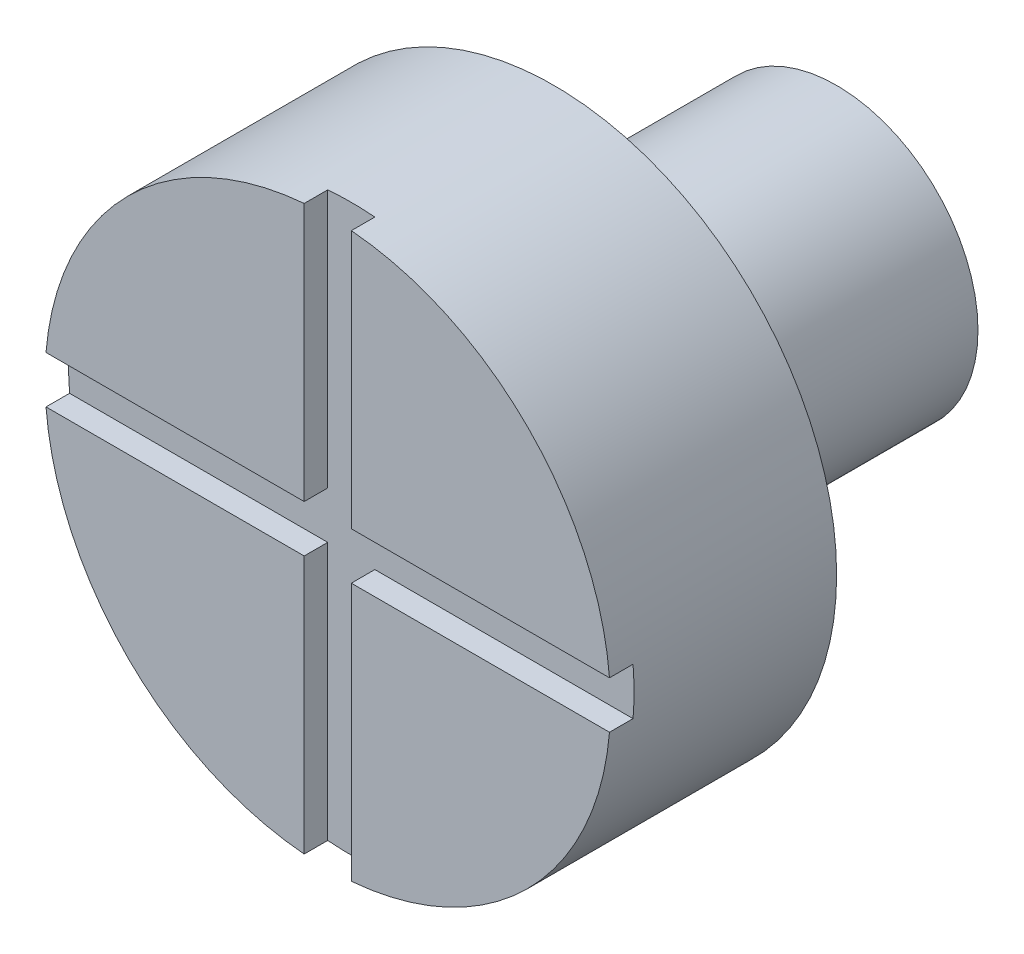
ISO-10303-21;
HEADER;
FILE_DESCRIPTION(('STEP AP214'),'2;1');
FILE_NAME('part.step','',(''),(''),'','','');
FILE_SCHEMA(('AUTOMOTIVE_DESIGN { 1 0 10303 214 1 1 1 1 }'));
ENDSEC;
DATA;
#1=APPLICATION_CONTEXT('core data for automotive mechanical design processes');
#2=APPLICATION_PROTOCOL_DEFINITION('international standard','automotive_design',2000,#1);
#3=PRODUCT_CONTEXT('',#1,'mechanical');
#4=PRODUCT('Part','Part','',(#3));
#5=PRODUCT_RELATED_PRODUCT_CATEGORY('part','',(#4));
#6=PRODUCT_DEFINITION_FORMATION('','',#4);
#7=PRODUCT_DEFINITION_CONTEXT('part definition',#1,'design');
#8=PRODUCT_DEFINITION('design','',#6,#7);
#9=PRODUCT_DEFINITION_SHAPE('','',#8);
#10=(LENGTH_UNIT() NAMED_UNIT(*) SI_UNIT(.MILLI.,.METRE.));
#11=(NAMED_UNIT(*) PLANE_ANGLE_UNIT() SI_UNIT($,.RADIAN.));
#12=(NAMED_UNIT(*) SI_UNIT($,.STERADIAN.) SOLID_ANGLE_UNIT());
#13=UNCERTAINTY_MEASURE_WITH_UNIT(LENGTH_MEASURE(1.E-05),#10,'distance_accuracy_value','');
#14=(GEOMETRIC_REPRESENTATION_CONTEXT(3) GLOBAL_UNCERTAINTY_ASSIGNED_CONTEXT((#13)) GLOBAL_UNIT_ASSIGNED_CONTEXT((#10,
#11,#12)) REPRESENTATION_CONTEXT('',''));
#15=CARTESIAN_POINT('',(0.,0.,0.));
#16=DIRECTION('',(0.,0.,1.));
#17=DIRECTION('',(1.,0.,0.));
#18=AXIS2_PLACEMENT_3D('',#15,#16,#17);
#19=CARTESIAN_POINT('',(0.,0.,0.));
#20=DIRECTION('',(0.,0.,-1.));
#21=DIRECTION('',(-1.,0.,0.));
#22=AXIS2_PLACEMENT_3D('',#19,#20,#21);
#23=PLANE('',#22);
#24=DIRECTION('',(1.,0.,0.));
#25=VECTOR('',#24,1.);
#26=CARTESIAN_POINT('',(0.024517546157501,0.25,0.));
#27=LINE('',#26,#25);
#28=CARTESIAN_POINT('',(-2.98956518577535,0.25,0.));
#29=VERTEX_POINT('',#28);
#30=CARTESIAN_POINT('',(-0.25,0.249999999999999,0.));
#31=VERTEX_POINT('',#30);
#32=EDGE_CURVE('E166',#29,#31,#27,.T.);
#33=ORIENTED_EDGE('',*,*,#32,.T.);
#34=DIRECTION('',(0.,-1.,0.));
#35=VECTOR('',#34,1.);
#36=CARTESIAN_POINT('',(-0.25,-6.77977499955135,0.));
#37=LINE('',#36,#35);
#38=CARTESIAN_POINT('',(-0.25,2.98956518577535,0.));
#39=VERTEX_POINT('',#38);
#40=EDGE_CURVE('E164',#39,#31,#37,.T.);
#41=ORIENTED_EDGE('',*,*,#40,.F.);
#42=CARTESIAN_POINT('',(0.,0.,0.));
#43=DIRECTION('',(0.,0.,1.));
#44=DIRECTION('',(1.,0.,0.));
#45=AXIS2_PLACEMENT_3D('',#42,#43,#44);
#46=CIRCLE('',#45,3.);
#47=EDGE_CURVE('E192',#39,#29,#46,.T.);
#48=ORIENTED_EDGE('',*,*,#47,.T.);
#49=EDGE_LOOP('',(#33,#41,#48));
#50=FACE_BOUND('',#49,.T.);
#51=ADVANCED_FACE('F32',(#50),#23,.F.);
#52=DIRECTION('',(0.,-1.,0.));
#53=VECTOR('',#52,1.);
#54=CARTESIAN_POINT('',(0.250000000000001,-6.77977499955135,0.));
#55=LINE('',#54,#53);
#56=CARTESIAN_POINT('',(0.25,2.98956518577535,0.));
#57=VERTEX_POINT('',#56);
#58=CARTESIAN_POINT('',(0.25,0.249999999999999,0.));
#59=VERTEX_POINT('',#58);
#60=EDGE_CURVE('E161',#57,#59,#55,.T.);
#61=ORIENTED_EDGE('',*,*,#60,.T.);
#62=DIRECTION('',(1.,0.,0.));
#63=VECTOR('',#62,1.);
#64=CARTESIAN_POINT('',(0.024517546157501,0.25,0.));
#65=LINE('',#64,#63);
#66=CARTESIAN_POINT('',(2.98956518577535,0.25,0.));
#67=VERTEX_POINT('',#66);
#68=EDGE_CURVE('E158',#59,#67,#65,.T.);
#69=ORIENTED_EDGE('',*,*,#68,.T.);
#70=EDGE_CURVE('E188',#67,#57,#46,.T.);
#71=ORIENTED_EDGE('',*,*,#70,.T.);
#72=EDGE_LOOP('',(#61,#69,#71));
#73=FACE_BOUND('',#72,.T.);
#74=ADVANCED_FACE('F259',(#73),#23,.F.);
#75=CARTESIAN_POINT('',(-2.98956518577535,-0.25,0.));
#76=VERTEX_POINT('',#75);
#77=CARTESIAN_POINT('',(-0.25,-2.98956518577535,0.));
#78=VERTEX_POINT('',#77);
#79=EDGE_CURVE('E227',#76,#78,#46,.T.);
#80=ORIENTED_EDGE('',*,*,#79,.T.);
#81=DIRECTION('',(0.,-1.,0.));
#82=VECTOR('',#81,1.);
#83=CARTESIAN_POINT('',(-0.25,-6.77977499955135,0.));
#84=LINE('',#83,#82);
#85=CARTESIAN_POINT('',(-0.25,-0.25,0.));
#86=VERTEX_POINT('',#85);
#87=EDGE_CURVE('E153',#86,#78,#84,.T.);
#88=ORIENTED_EDGE('',*,*,#87,.F.);
#89=DIRECTION('',(1.,0.,0.));
#90=VECTOR('',#89,1.);
#91=CARTESIAN_POINT('',(0.0245175461575013,-0.25,0.));
#92=LINE('',#91,#90);
#93=EDGE_CURVE('E169',#76,#86,#92,.T.);
#94=ORIENTED_EDGE('',*,*,#93,.F.);
#95=EDGE_LOOP('',(#80,#88,#94));
#96=FACE_BOUND('',#95,.T.);
#97=ADVANCED_FACE('F263',(#96),#23,.F.);
#98=CARTESIAN_POINT('',(0.,0.,0.));
#99=DIRECTION('',(0.,0.,1.));
#100=DIRECTION('',(1.,0.,0.));
#101=AXIS2_PLACEMENT_3D('',#98,#99,#100);
#102=CYLINDRICAL_SURFACE('',#101,3.);
#103=CARTESIAN_POINT('',(0.,0.,-2.4));
#104=DIRECTION('',(0.,0.,1.));
#105=DIRECTION('',(1.,0.,0.));
#106=AXIS2_PLACEMENT_3D('',#103,#104,#105);
#107=CIRCLE('',#106,3.);
#108=CARTESIAN_POINT('',(3.,0.,-2.4));
#109=VERTEX_POINT('',#108);
#110=EDGE_CURVE('E184',#109,#109,#107,.T.);
#111=ORIENTED_EDGE('',*,*,#110,.T.);
#112=EDGE_LOOP('',(#111));
#113=FACE_BOUND('',#112,.T.);
#114=ORIENTED_EDGE('',*,*,#47,.F.);
#115=DIRECTION('',(0.,0.,1.));
#116=VECTOR('',#115,1.);
#117=CARTESIAN_POINT('',(-0.25,2.98956518577535,0.));
#118=LINE('',#117,#116);
#119=CARTESIAN_POINT('',(-0.25,2.98956518577535,-0.25));
#120=VERTEX_POINT('',#119);
#121=EDGE_CURVE('E11',#39,#120,#118,.F.);
#122=ORIENTED_EDGE('',*,*,#121,.T.);
#123=CARTESIAN_POINT('',(0.,0.,-0.25));
#124=DIRECTION('',(0.,0.,1.));
#125=DIRECTION('',(1.,0.,0.));
#126=AXIS2_PLACEMENT_3D('',#123,#124,#125);
#127=CIRCLE('',#126,3.);
#128=CARTESIAN_POINT('',(0.25,2.98956518577535,-0.25));
#129=VERTEX_POINT('',#128);
#130=EDGE_CURVE('E194',#129,#120,#127,.T.);
#131=ORIENTED_EDGE('',*,*,#130,.F.);
#132=DIRECTION('',(0.,0.,1.));
#133=VECTOR('',#132,1.);
#134=CARTESIAN_POINT('',(0.25,2.98956518577535,0.));
#135=LINE('',#134,#133);
#136=EDGE_CURVE('E40',#57,#129,#135,.F.);
#137=ORIENTED_EDGE('',*,*,#136,.F.);
#138=ORIENTED_EDGE('',*,*,#70,.F.);
#139=DIRECTION('',(0.,0.,1.));
#140=VECTOR('',#139,1.);
#141=CARTESIAN_POINT('',(2.98956518577535,0.25,0.));
#142=LINE('',#141,#140);
#143=CARTESIAN_POINT('',(2.98956518577535,0.25,-0.25));
#144=VERTEX_POINT('',#143);
#145=EDGE_CURVE('E196',#144,#67,#142,.T.);
#146=ORIENTED_EDGE('',*,*,#145,.F.);
#147=CARTESIAN_POINT('',(2.98956518577535,-0.25,-0.25));
#148=VERTEX_POINT('',#147);
#149=EDGE_CURVE('E191',#148,#144,#127,.T.);
#150=ORIENTED_EDGE('',*,*,#149,.F.);
#151=DIRECTION('',(0.,0.,1.));
#152=VECTOR('',#151,1.);
#153=CARTESIAN_POINT('',(2.98956518577535,-0.25,0.));
#154=LINE('',#153,#152);
#155=CARTESIAN_POINT('',(2.98956518577535,-0.25,0.));
#156=VERTEX_POINT('',#155);
#157=EDGE_CURVE('E137',#148,#156,#154,.T.);
#158=ORIENTED_EDGE('',*,*,#157,.T.);
#159=CARTESIAN_POINT('',(0.25,-2.98956518577535,0.));
#160=VERTEX_POINT('',#159);
#161=EDGE_CURVE('E187',#160,#156,#46,.T.);
#162=ORIENTED_EDGE('',*,*,#161,.F.);
#163=DIRECTION('',(0.,0.,1.));
#164=VECTOR('',#163,1.);
#165=CARTESIAN_POINT('',(0.25,-2.98956518577535,0.));
#166=LINE('',#165,#164);
#167=CARTESIAN_POINT('',(0.25,-2.98956518577535,-0.25));
#168=VERTEX_POINT('',#167);
#169=EDGE_CURVE('E198',#160,#168,#166,.F.);
#170=ORIENTED_EDGE('',*,*,#169,.T.);
#171=CARTESIAN_POINT('',(-0.25,-2.98956518577535,-0.25));
#172=VERTEX_POINT('',#171);
#173=EDGE_CURVE('E53',#172,#168,#127,.T.);
#174=ORIENTED_EDGE('',*,*,#173,.F.);
#175=DIRECTION('',(0.,0.,1.));
#176=VECTOR('',#175,1.);
#177=CARTESIAN_POINT('',(-0.25,-2.98956518577535,0.));
#178=LINE('',#177,#176);
#179=EDGE_CURVE('E200',#172,#78,#178,.T.);
#180=ORIENTED_EDGE('',*,*,#179,.T.);
#181=ORIENTED_EDGE('',*,*,#79,.F.);
#182=DIRECTION('',(0.,0.,1.));
#183=VECTOR('',#182,1.);
#184=CARTESIAN_POINT('',(-2.98956518577535,-0.25,0.));
#185=LINE('',#184,#183);
#186=CARTESIAN_POINT('',(-2.98956518577535,-0.25,-0.25));
#187=VERTEX_POINT('',#186);
#188=EDGE_CURVE('E206',#76,#187,#185,.F.);
#189=ORIENTED_EDGE('',*,*,#188,.T.);
#190=CARTESIAN_POINT('',(-2.98956518577535,0.25,-0.25));
#191=VERTEX_POINT('',#190);
#192=EDGE_CURVE('E203',#191,#187,#127,.T.);
#193=ORIENTED_EDGE('',*,*,#192,.F.);
#194=DIRECTION('',(0.,0.,1.));
#195=VECTOR('',#194,1.);
#196=CARTESIAN_POINT('',(-2.98956518577535,0.25,0.));
#197=LINE('',#196,#195);
#198=EDGE_CURVE('E204',#29,#191,#197,.F.);
#199=ORIENTED_EDGE('',*,*,#198,.F.);
#200=EDGE_LOOP('',(#114,#122,#131,#137,#138,#146,#150,#158,#162,#170,#174,#180,#181,#189,#193,#199));
#201=FACE_BOUND('',#200,.T.);
#202=ADVANCED_FACE('F225',(#113,#201),#102,.T.);
#203=ORIENTED_EDGE('',*,*,#161,.T.);
#204=DIRECTION('',(1.,0.,0.));
#205=VECTOR('',#204,1.);
#206=CARTESIAN_POINT('',(0.024517546157501,-0.25,0.));
#207=LINE('',#206,#205);
#208=CARTESIAN_POINT('',(0.25,-0.249999999999999,0.));
#209=VERTEX_POINT('',#208);
#210=EDGE_CURVE('E156',#209,#156,#207,.T.);
#211=ORIENTED_EDGE('',*,*,#210,.F.);
#212=DIRECTION('',(0.,1.,0.));
#213=VECTOR('',#212,1.);
#214=CARTESIAN_POINT('',(0.25,-6.77977499955135,0.));
#215=LINE('',#214,#213);
#216=EDGE_CURVE('E129',#160,#209,#215,.T.);
#217=ORIENTED_EDGE('',*,*,#216,.F.);
#218=EDGE_LOOP('',(#203,#211,#217));
#219=FACE_BOUND('',#218,.T.);
#220=ADVANCED_FACE('F34',(#219),#23,.F.);
#221=CARTESIAN_POINT('',(0.,3.,-2.4));
#222=DIRECTION('',(0.,0.,1.));
#223=DIRECTION('',(1.,0.,0.));
#224=AXIS2_PLACEMENT_3D('',#221,#222,#223);
#225=PLANE('',#224);
#226=ORIENTED_EDGE('',*,*,#110,.F.);
#227=EDGE_LOOP('',(#226));
#228=FACE_BOUND('',#227,.T.);
#229=CARTESIAN_POINT('',(0.,0.,-2.4));
#230=DIRECTION('',(0.,0.,1.));
#231=DIRECTION('',(1.,0.,0.));
#232=AXIS2_PLACEMENT_3D('',#229,#230,#231);
#233=CIRCLE('',#232,1.5);
#234=CARTESIAN_POINT('',(1.5,0.,-2.4));
#235=VERTEX_POINT('',#234);
#236=EDGE_CURVE('E181',#235,#235,#233,.T.);
#237=ORIENTED_EDGE('',*,*,#236,.T.);
#238=EDGE_LOOP('',(#237));
#239=FACE_BOUND('',#238,.T.);
#240=ADVANCED_FACE('F266',(#228,#239),#225,.F.);
#241=CARTESIAN_POINT('',(0.,0.,0.));
#242=DIRECTION('',(0.,0.,1.));
#243=DIRECTION('',(1.,0.,0.));
#244=AXIS2_PLACEMENT_3D('',#241,#242,#243);
#245=CYLINDRICAL_SURFACE('',#244,1.5);
#246=ORIENTED_EDGE('',*,*,#236,.F.);
#247=EDGE_LOOP('',(#246));
#248=FACE_BOUND('',#247,.T.);
#249=CARTESIAN_POINT('',(0.,0.,-5.4));
#250=DIRECTION('',(0.,0.,1.));
#251=DIRECTION('',(1.,0.,0.));
#252=AXIS2_PLACEMENT_3D('',#249,#250,#251);
#253=CIRCLE('',#252,1.5);
#254=CARTESIAN_POINT('',(1.5,0.,-5.4));
#255=VERTEX_POINT('',#254);
#256=EDGE_CURVE('E174',#255,#255,#253,.T.);
#257=ORIENTED_EDGE('',*,*,#256,.T.);
#258=EDGE_LOOP('',(#257));
#259=FACE_BOUND('',#258,.T.);
#260=ADVANCED_FACE('F271',(#248,#259),#245,.T.);
#261=CARTESIAN_POINT('',(0.,1.5,-5.4));
#262=DIRECTION('',(0.,0.,1.));
#263=DIRECTION('',(1.,0.,0.));
#264=AXIS2_PLACEMENT_3D('',#261,#262,#263);
#265=PLANE('',#264);
#266=ORIENTED_EDGE('',*,*,#256,.F.);
#267=EDGE_LOOP('',(#266));
#268=FACE_BOUND('',#267,.T.);
#269=ADVANCED_FACE('F299',(#268),#265,.F.);
#270=CARTESIAN_POINT('',(-0.25,-6.77977499955135,-0.25));
#271=DIRECTION('',(-1.,0.,0.));
#272=DIRECTION('',(0.,0.,1.));
#273=AXIS2_PLACEMENT_3D('',#270,#271,#272);
#274=PLANE('',#273);
#275=DIRECTION('',(0.,-1.,0.));
#276=VECTOR('',#275,1.);
#277=CARTESIAN_POINT('',(-0.25,-6.77977499955135,-0.25));
#278=LINE('',#277,#276);
#279=CARTESIAN_POINT('',(-0.25,-0.25,-0.25));
#280=VERTEX_POINT('',#279);
#281=EDGE_CURVE('E123',#280,#172,#278,.T.);
#282=ORIENTED_EDGE('',*,*,#281,.F.);
#283=DIRECTION('',(0.,0.,1.));
#284=VECTOR('',#283,1.);
#285=CARTESIAN_POINT('',(-0.25,-0.25,-0.25));
#286=LINE('',#285,#284);
#287=EDGE_CURVE('E171',#280,#86,#286,.T.);
#288=ORIENTED_EDGE('',*,*,#287,.T.);
#289=ORIENTED_EDGE('',*,*,#87,.T.);
#290=ORIENTED_EDGE('',*,*,#179,.F.);
#291=EDGE_LOOP('',(#282,#288,#289,#290));
#292=FACE_BOUND('',#291,.T.);
#293=ADVANCED_FACE('F256',(#292),#274,.F.);
#294=CARTESIAN_POINT('',(0.0245175461575013,-0.25,-0.25));
#295=DIRECTION('',(0.,-1.,0.));
#296=DIRECTION('',(1.,0.,0.));
#297=AXIS2_PLACEMENT_3D('',#294,#295,#296);
#298=PLANE('',#297);
#299=ORIENTED_EDGE('',*,*,#93,.T.);
#300=ORIENTED_EDGE('',*,*,#287,.F.);
#301=DIRECTION('',(1.,0.,0.));
#302=VECTOR('',#301,1.);
#303=CARTESIAN_POINT('',(0.0245175461575013,-0.25,-0.25));
#304=LINE('',#303,#302);
#305=EDGE_CURVE('E133',#187,#280,#304,.T.);
#306=ORIENTED_EDGE('',*,*,#305,.F.);
#307=ORIENTED_EDGE('',*,*,#188,.F.);
#308=EDGE_LOOP('',(#299,#300,#306,#307));
#309=FACE_BOUND('',#308,.T.);
#310=ADVANCED_FACE('F220',(#309),#298,.F.);
#311=CARTESIAN_POINT('',(0.024517546157501,0.25,-0.25));
#312=DIRECTION('',(0.,-1.,0.));
#313=DIRECTION('',(0.,0.,-1.));
#314=AXIS2_PLACEMENT_3D('',#311,#312,#313);
#315=PLANE('',#314);
#316=ORIENTED_EDGE('',*,*,#198,.T.);
#317=DIRECTION('',(1.,0.,0.));
#318=VECTOR('',#317,1.);
#319=CARTESIAN_POINT('',(0.024517546157501,0.25,-0.25));
#320=LINE('',#319,#318);
#321=CARTESIAN_POINT('',(-0.25,0.249999999999999,-0.25));
#322=VERTEX_POINT('',#321);
#323=EDGE_CURVE('E149',#191,#322,#320,.T.);
#324=ORIENTED_EDGE('',*,*,#323,.T.);
#325=DIRECTION('',(0.,0.,1.));
#326=VECTOR('',#325,1.);
#327=CARTESIAN_POINT('',(-0.25,0.249999999999999,-0.25));
#328=LINE('',#327,#326);
#329=EDGE_CURVE('E175',#322,#31,#328,.T.);
#330=ORIENTED_EDGE('',*,*,#329,.T.);
#331=ORIENTED_EDGE('',*,*,#32,.F.);
#332=EDGE_LOOP('',(#316,#324,#330,#331));
#333=FACE_BOUND('',#332,.T.);
#334=ADVANCED_FACE('F248',(#333),#315,.T.);
#335=CARTESIAN_POINT('',(-0.25,-6.77977499955135,-0.25));
#336=DIRECTION('',(-1.,0.,0.));
#337=DIRECTION('',(0.,-1.,0.));
#338=AXIS2_PLACEMENT_3D('',#335,#336,#337);
#339=PLANE('',#338);
#340=ORIENTED_EDGE('',*,*,#40,.T.);
#341=ORIENTED_EDGE('',*,*,#329,.F.);
#342=DIRECTION('',(0.,-1.,0.));
#343=VECTOR('',#342,1.);
#344=CARTESIAN_POINT('',(-0.25,-6.77977499955135,-0.25));
#345=LINE('',#344,#343);
#346=EDGE_CURVE('E147',#120,#322,#345,.T.);
#347=ORIENTED_EDGE('',*,*,#346,.F.);
#348=ORIENTED_EDGE('',*,*,#121,.F.);
#349=EDGE_LOOP('',(#340,#341,#347,#348));
#350=FACE_BOUND('',#349,.T.);
#351=ADVANCED_FACE('F244',(#350),#339,.F.);
#352=CARTESIAN_POINT('',(0.250000000000001,-6.77977499955135,-0.25));
#353=DIRECTION('',(-1.,0.,0.));
#354=DIRECTION('',(0.,-1.,0.));
#355=AXIS2_PLACEMENT_3D('',#352,#353,#354);
#356=PLANE('',#355);
#357=ORIENTED_EDGE('',*,*,#136,.T.);
#358=DIRECTION('',(0.,-1.,0.));
#359=VECTOR('',#358,1.);
#360=CARTESIAN_POINT('',(0.250000000000001,-6.77977499955135,-0.25));
#361=LINE('',#360,#359);
#362=CARTESIAN_POINT('',(0.25,0.249999999999999,-0.25));
#363=VERTEX_POINT('',#362);
#364=EDGE_CURVE('E142',#129,#363,#361,.T.);
#365=ORIENTED_EDGE('',*,*,#364,.T.);
#366=DIRECTION('',(0.,0.,1.));
#367=VECTOR('',#366,1.);
#368=CARTESIAN_POINT('',(0.25,0.249999999999999,-0.25));
#369=LINE('',#368,#367);
#370=EDGE_CURVE('E132',#363,#59,#369,.T.);
#371=ORIENTED_EDGE('',*,*,#370,.T.);
#372=ORIENTED_EDGE('',*,*,#60,.F.);
#373=EDGE_LOOP('',(#357,#365,#371,#372));
#374=FACE_BOUND('',#373,.T.);
#375=ADVANCED_FACE('F241',(#374),#356,.T.);
#376=CARTESIAN_POINT('',(0.024517546157501,0.25,-0.25));
#377=DIRECTION('',(0.,-1.,0.));
#378=DIRECTION('',(0.,0.,-1.));
#379=AXIS2_PLACEMENT_3D('',#376,#377,#378);
#380=PLANE('',#379);
#381=ORIENTED_EDGE('',*,*,#145,.T.);
#382=ORIENTED_EDGE('',*,*,#68,.F.);
#383=ORIENTED_EDGE('',*,*,#370,.F.);
#384=DIRECTION('',(1.,0.,0.));
#385=VECTOR('',#384,1.);
#386=CARTESIAN_POINT('',(0.024517546157501,0.25,-0.25));
#387=LINE('',#386,#385);
#388=EDGE_CURVE('E139',#363,#144,#387,.T.);
#389=ORIENTED_EDGE('',*,*,#388,.T.);
#390=EDGE_LOOP('',(#381,#382,#383,#389));
#391=FACE_BOUND('',#390,.T.);
#392=ADVANCED_FACE('F239',(#391),#380,.T.);
#393=CARTESIAN_POINT('',(0.024517546157501,-0.25,-0.25));
#394=DIRECTION('',(0.,-1.,0.));
#395=DIRECTION('',(0.,0.,-1.));
#396=AXIS2_PLACEMENT_3D('',#393,#394,#395);
#397=PLANE('',#396);
#398=DIRECTION('',(1.,0.,0.));
#399=VECTOR('',#398,1.);
#400=CARTESIAN_POINT('',(0.024517546157501,-0.25,-0.25));
#401=LINE('',#400,#399);
#402=CARTESIAN_POINT('',(0.25,-0.249999999999999,-0.25));
#403=VERTEX_POINT('',#402);
#404=EDGE_CURVE('E47',#403,#148,#401,.T.);
#405=ORIENTED_EDGE('',*,*,#404,.F.);
#406=DIRECTION('',(0.,0.,1.));
#407=VECTOR('',#406,1.);
#408=CARTESIAN_POINT('',(0.25,-0.249999999999999,-0.25));
#409=LINE('',#408,#407);
#410=EDGE_CURVE('E126',#403,#209,#409,.T.);
#411=ORIENTED_EDGE('',*,*,#410,.T.);
#412=ORIENTED_EDGE('',*,*,#210,.T.);
#413=ORIENTED_EDGE('',*,*,#157,.F.);
#414=EDGE_LOOP('',(#405,#411,#412,#413));
#415=FACE_BOUND('',#414,.T.);
#416=ADVANCED_FACE('F135',(#415),#397,.F.);
#417=CARTESIAN_POINT('',(0.25,-6.77977499955135,-0.25));
#418=DIRECTION('',(1.,0.,0.));
#419=DIRECTION('',(0.,0.,-1.));
#420=AXIS2_PLACEMENT_3D('',#417,#418,#419);
#421=PLANE('',#420);
#422=ORIENTED_EDGE('',*,*,#216,.T.);
#423=ORIENTED_EDGE('',*,*,#410,.F.);
#424=DIRECTION('',(0.,1.,0.));
#425=VECTOR('',#424,1.);
#426=CARTESIAN_POINT('',(0.25,-6.77977499955135,-0.25));
#427=LINE('',#426,#425);
#428=EDGE_CURVE('E118',#168,#403,#427,.T.);
#429=ORIENTED_EDGE('',*,*,#428,.F.);
#430=ORIENTED_EDGE('',*,*,#169,.F.);
#431=EDGE_LOOP('',(#422,#423,#429,#430));
#432=FACE_BOUND('',#431,.T.);
#433=ADVANCED_FACE('F127',(#432),#421,.F.);
#434=CARTESIAN_POINT('',(0.024517546157501,-6.77977499955135,-0.25));
#435=DIRECTION('',(0.,0.,1.));
#436=DIRECTION('',(1.,0.,0.));
#437=AXIS2_PLACEMENT_3D('',#434,#435,#436);
#438=PLANE('',#437);
#439=ORIENTED_EDGE('',*,*,#130,.T.);
#440=ORIENTED_EDGE('',*,*,#346,.T.);
#441=ORIENTED_EDGE('',*,*,#323,.F.);
#442=ORIENTED_EDGE('',*,*,#192,.T.);
#443=ORIENTED_EDGE('',*,*,#305,.T.);
#444=ORIENTED_EDGE('',*,*,#281,.T.);
#445=ORIENTED_EDGE('',*,*,#173,.T.);
#446=ORIENTED_EDGE('',*,*,#428,.T.);
#447=ORIENTED_EDGE('',*,*,#404,.T.);
#448=ORIENTED_EDGE('',*,*,#149,.T.);
#449=ORIENTED_EDGE('',*,*,#388,.F.);
#450=ORIENTED_EDGE('',*,*,#364,.F.);
#451=EDGE_LOOP('',(#439,#440,#441,#442,#443,#444,#445,#446,#447,#448,#449,#450));
#452=FACE_BOUND('',#451,.T.);
#453=ADVANCED_FACE('F120',(#452),#438,.T.);
#454=CLOSED_SHELL('',(#51,#74,#97,#202,#220,#240,#260,#269,#293,#310,#334,#351,#375,#392,#416,
#433,#453));
#455=MANIFOLD_SOLID_BREP('B2',#454);
#456=ADVANCED_BREP_SHAPE_REPRESENTATION('',(#18,#455),#14);
#457=SHAPE_DEFINITION_REPRESENTATION(#9,#456);
ENDSEC;
END-ISO-10303-21;
